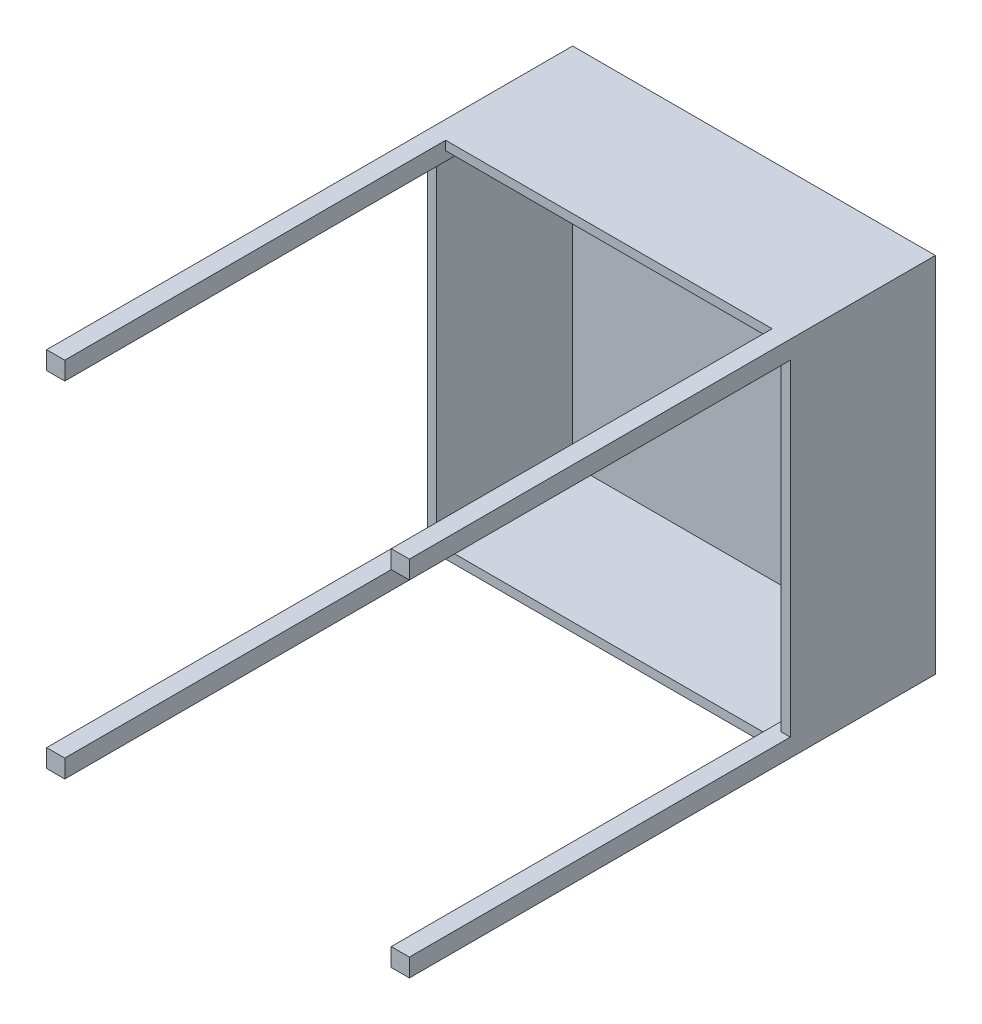
ISO-10303-21;
HEADER;
FILE_DESCRIPTION(('STEP AP214'),'2;1');
FILE_NAME('part.step','',(''),(''),'','','');
FILE_SCHEMA(('AUTOMOTIVE_DESIGN { 1 0 10303 214 1 1 1 1 }'));
ENDSEC;
DATA;
#1=APPLICATION_CONTEXT('core data for automotive mechanical design processes');
#2=APPLICATION_PROTOCOL_DEFINITION('international standard','automotive_design',2000,#1);
#3=PRODUCT_CONTEXT('',#1,'mechanical');
#4=PRODUCT('Part','Part','',(#3));
#5=PRODUCT_RELATED_PRODUCT_CATEGORY('part','',(#4));
#6=PRODUCT_DEFINITION_FORMATION('','',#4);
#7=PRODUCT_DEFINITION_CONTEXT('part definition',#1,'design');
#8=PRODUCT_DEFINITION('design','',#6,#7);
#9=PRODUCT_DEFINITION_SHAPE('','',#8);
#10=(LENGTH_UNIT() NAMED_UNIT(*) SI_UNIT(.MILLI.,.METRE.));
#11=(NAMED_UNIT(*) PLANE_ANGLE_UNIT() SI_UNIT($,.RADIAN.));
#12=(NAMED_UNIT(*) SI_UNIT($,.STERADIAN.) SOLID_ANGLE_UNIT());
#13=UNCERTAINTY_MEASURE_WITH_UNIT(LENGTH_MEASURE(1.E-05),#10,'distance_accuracy_value','');
#14=(GEOMETRIC_REPRESENTATION_CONTEXT(3) GLOBAL_UNCERTAINTY_ASSIGNED_CONTEXT((#13)) GLOBAL_UNIT_ASSIGNED_CONTEXT((#10,
#11,#12)) REPRESENTATION_CONTEXT('',''));
#15=CARTESIAN_POINT('',(0.,0.,0.));
#16=DIRECTION('',(0.,0.,1.));
#17=DIRECTION('',(1.,0.,0.));
#18=AXIS2_PLACEMENT_3D('',#15,#16,#17);
#19=CARTESIAN_POINT('',(0.,0.,0.));
#20=DIRECTION('',(0.,1.,0.));
#21=DIRECTION('',(1.,0.,0.));
#22=AXIS2_PLACEMENT_3D('',#19,#20,#21);
#23=PLANE('',#22);
#24=DIRECTION('',(0.,0.,1.));
#25=VECTOR('',#24,1.);
#26=CARTESIAN_POINT('',(1000.,0.,0.));
#27=LINE('',#26,#25);
#28=CARTESIAN_POINT('',(1000.,0.,0.));
#29=VERTEX_POINT('',#28);
#30=CARTESIAN_POINT('',(1000.,0.,1450.));
#31=VERTEX_POINT('',#30);
#32=EDGE_CURVE('E427',#29,#31,#27,.T.);
#33=ORIENTED_EDGE('',*,*,#32,.T.);
#34=DIRECTION('',(1.,0.,0.));
#35=VECTOR('',#34,1.);
#36=CARTESIAN_POINT('',(950.,0.,1450.));
#37=LINE('',#36,#35);
#38=CARTESIAN_POINT('',(950.,0.,1450.));
#39=VERTEX_POINT('',#38);
#40=EDGE_CURVE('E281',#39,#31,#37,.T.);
#41=ORIENTED_EDGE('',*,*,#40,.F.);
#42=DIRECTION('',(0.,0.,1.));
#43=VECTOR('',#42,1.);
#44=CARTESIAN_POINT('',(950.,0.,0.));
#45=LINE('',#44,#43);
#46=CARTESIAN_POINT('',(950.,0.,400.));
#47=VERTEX_POINT('',#46);
#48=EDGE_CURVE('E315',#47,#39,#45,.T.);
#49=ORIENTED_EDGE('',*,*,#48,.F.);
#50=DIRECTION('',(1.,0.,0.));
#51=VECTOR('',#50,1.);
#52=CARTESIAN_POINT('',(0.,0.,400.));
#53=LINE('',#52,#51);
#54=CARTESIAN_POINT('',(50.,0.,400.));
#55=VERTEX_POINT('',#54);
#56=EDGE_CURVE('E337',#55,#47,#53,.T.);
#57=ORIENTED_EDGE('',*,*,#56,.F.);
#58=DIRECTION('',(0.,0.,1.));
#59=VECTOR('',#58,1.);
#60=CARTESIAN_POINT('',(50.,0.,0.));
#61=LINE('',#60,#59);
#62=CARTESIAN_POINT('',(50.,0.,1450.));
#63=VERTEX_POINT('',#62);
#64=EDGE_CURVE('E235',#55,#63,#61,.T.);
#65=ORIENTED_EDGE('',*,*,#64,.T.);
#66=DIRECTION('',(1.,0.,0.));
#67=VECTOR('',#66,1.);
#68=CARTESIAN_POINT('',(0.,0.,1450.));
#69=LINE('',#68,#67);
#70=CARTESIAN_POINT('',(0.,0.,1450.));
#71=VERTEX_POINT('',#70);
#72=EDGE_CURVE('E229',#71,#63,#69,.T.);
#73=ORIENTED_EDGE('',*,*,#72,.F.);
#74=DIRECTION('',(0.,0.,1.));
#75=VECTOR('',#74,1.);
#76=CARTESIAN_POINT('',(0.,0.,0.));
#77=LINE('',#76,#75);
#78=CARTESIAN_POINT('',(0.,0.,0.));
#79=VERTEX_POINT('',#78);
#80=EDGE_CURVE('E232',#79,#71,#77,.T.);
#81=ORIENTED_EDGE('',*,*,#80,.F.);
#82=DIRECTION('',(1.,0.,0.));
#83=VECTOR('',#82,1.);
#84=CARTESIAN_POINT('',(0.,0.,0.));
#85=LINE('',#84,#83);
#86=EDGE_CURVE('E9',#79,#29,#85,.T.);
#87=ORIENTED_EDGE('',*,*,#86,.T.);
#88=EDGE_LOOP('',(#33,#41,#49,#57,#65,#73,#81,#87));
#89=FACE_BOUND('',#88,.T.);
#90=ADVANCED_FACE('F15',(#89),#23,.F.);
#91=CARTESIAN_POINT('',(0.,0.,0.));
#92=DIRECTION('',(0.,0.,1.));
#93=DIRECTION('',(1.,0.,0.));
#94=AXIS2_PLACEMENT_3D('',#91,#92,#93);
#95=PLANE('',#94);
#96=DIRECTION('',(0.,-1.,0.));
#97=VECTOR('',#96,1.);
#98=CARTESIAN_POINT('',(1000.,1000.,0.));
#99=LINE('',#98,#97);
#100=CARTESIAN_POINT('',(1000.,1000.,0.));
#101=VERTEX_POINT('',#100);
#102=EDGE_CURVE('E282',#101,#29,#99,.T.);
#103=ORIENTED_EDGE('',*,*,#102,.T.);
#104=ORIENTED_EDGE('',*,*,#86,.F.);
#105=DIRECTION('',(0.,-1.,0.));
#106=VECTOR('',#105,1.);
#107=CARTESIAN_POINT('',(0.,1000.,0.));
#108=LINE('',#107,#106);
#109=CARTESIAN_POINT('',(0.,1000.,0.));
#110=VERTEX_POINT('',#109);
#111=EDGE_CURVE('E250',#110,#79,#108,.T.);
#112=ORIENTED_EDGE('',*,*,#111,.F.);
#113=DIRECTION('',(1.,0.,0.));
#114=VECTOR('',#113,1.);
#115=CARTESIAN_POINT('',(0.,1000.,0.));
#116=LINE('',#115,#114);
#117=EDGE_CURVE('E23',#110,#101,#116,.T.);
#118=ORIENTED_EDGE('',*,*,#117,.T.);
#119=EDGE_LOOP('',(#103,#104,#112,#118));
#120=FACE_BOUND('',#119,.T.);
#121=ADVANCED_FACE('F544',(#120),#95,.F.);
#122=CARTESIAN_POINT('',(0.,1000.,0.));
#123=DIRECTION('',(0.,1.,0.));
#124=DIRECTION('',(1.,0.,0.));
#125=AXIS2_PLACEMENT_3D('',#122,#123,#124);
#126=PLANE('',#125);
#127=ORIENTED_EDGE('',*,*,#117,.F.);
#128=DIRECTION('',(0.,0.,-1.));
#129=VECTOR('',#128,1.);
#130=CARTESIAN_POINT('',(0.,1000.,1450.));
#131=LINE('',#130,#129);
#132=CARTESIAN_POINT('',(0.,1000.,1450.));
#133=VERTEX_POINT('',#132);
#134=EDGE_CURVE('E305',#133,#110,#131,.T.);
#135=ORIENTED_EDGE('',*,*,#134,.F.);
#136=DIRECTION('',(1.,0.,0.));
#137=VECTOR('',#136,1.);
#138=CARTESIAN_POINT('',(0.,1000.,1450.));
#139=LINE('',#138,#137);
#140=CARTESIAN_POINT('',(50.,1000.,1450.));
#141=VERTEX_POINT('',#140);
#142=EDGE_CURVE('E311',#133,#141,#139,.T.);
#143=ORIENTED_EDGE('',*,*,#142,.T.);
#144=DIRECTION('',(0.,0.,1.));
#145=VECTOR('',#144,1.);
#146=CARTESIAN_POINT('',(50.,1000.,0.));
#147=LINE('',#146,#145);
#148=CARTESIAN_POINT('',(50.,1000.,400.));
#149=VERTEX_POINT('',#148);
#150=EDGE_CURVE('E466',#149,#141,#147,.T.);
#151=ORIENTED_EDGE('',*,*,#150,.F.);
#152=DIRECTION('',(1.,0.,0.));
#153=VECTOR('',#152,1.);
#154=CARTESIAN_POINT('',(0.,1000.,400.));
#155=LINE('',#154,#153);
#156=CARTESIAN_POINT('',(950.,1000.,400.));
#157=VERTEX_POINT('',#156);
#158=EDGE_CURVE('E471',#149,#157,#155,.T.);
#159=ORIENTED_EDGE('',*,*,#158,.T.);
#160=DIRECTION('',(0.,0.,1.));
#161=VECTOR('',#160,1.);
#162=CARTESIAN_POINT('',(950.,1000.,0.));
#163=LINE('',#162,#161);
#164=CARTESIAN_POINT('',(950.,1000.,1450.));
#165=VERTEX_POINT('',#164);
#166=EDGE_CURVE('E441',#157,#165,#163,.T.);
#167=ORIENTED_EDGE('',*,*,#166,.T.);
#168=DIRECTION('',(1.,0.,0.));
#169=VECTOR('',#168,1.);
#170=CARTESIAN_POINT('',(950.,1000.,1450.));
#171=LINE('',#170,#169);
#172=CARTESIAN_POINT('',(1000.,1000.,1450.));
#173=VERTEX_POINT('',#172);
#174=EDGE_CURVE('E384',#165,#173,#171,.T.);
#175=ORIENTED_EDGE('',*,*,#174,.T.);
#176=DIRECTION('',(0.,0.,-1.));
#177=VECTOR('',#176,1.);
#178=CARTESIAN_POINT('',(1000.,1000.,1450.));
#179=LINE('',#178,#177);
#180=EDGE_CURVE('E277',#173,#101,#179,.T.);
#181=ORIENTED_EDGE('',*,*,#180,.T.);
#182=EDGE_LOOP('',(#127,#135,#143,#151,#159,#167,#175,#181));
#183=FACE_BOUND('',#182,.T.);
#184=ADVANCED_FACE('F502',(#183),#126,.T.);
#185=CARTESIAN_POINT('',(0.,950.,1450.));
#186=DIRECTION('',(0.,0.,1.));
#187=DIRECTION('',(1.,0.,0.));
#188=AXIS2_PLACEMENT_3D('',#185,#186,#187);
#189=PLANE('',#188);
#190=DIRECTION('',(0.,1.,0.));
#191=VECTOR('',#190,1.);
#192=CARTESIAN_POINT('',(0.,950.,1450.));
#193=LINE('',#192,#191);
#194=CARTESIAN_POINT('',(0.,950.,1450.));
#195=VERTEX_POINT('',#194);
#196=EDGE_CURVE('E301',#195,#133,#193,.T.);
#197=ORIENTED_EDGE('',*,*,#196,.F.);
#198=DIRECTION('',(1.,0.,0.));
#199=VECTOR('',#198,1.);
#200=CARTESIAN_POINT('',(0.,950.,1450.));
#201=LINE('',#200,#199);
#202=CARTESIAN_POINT('',(50.,950.,1450.));
#203=VERTEX_POINT('',#202);
#204=EDGE_CURVE('E373',#195,#203,#201,.T.);
#205=ORIENTED_EDGE('',*,*,#204,.T.);
#206=DIRECTION('',(0.,1.,0.));
#207=VECTOR('',#206,1.);
#208=CARTESIAN_POINT('',(50.,950.,1450.));
#209=LINE('',#208,#207);
#210=EDGE_CURVE('E467',#203,#141,#209,.T.);
#211=ORIENTED_EDGE('',*,*,#210,.T.);
#212=ORIENTED_EDGE('',*,*,#142,.F.);
#213=EDGE_LOOP('',(#197,#205,#211,#212));
#214=FACE_BOUND('',#213,.T.);
#215=ADVANCED_FACE('F506',(#214),#189,.T.);
#216=CARTESIAN_POINT('',(0.,950.,0.));
#217=DIRECTION('',(0.,1.,0.));
#218=DIRECTION('',(1.,0.,0.));
#219=AXIS2_PLACEMENT_3D('',#216,#217,#218);
#220=PLANE('',#219);
#221=ORIENTED_EDGE('',*,*,#204,.F.);
#222=DIRECTION('',(0.,0.,1.));
#223=VECTOR('',#222,1.);
#224=CARTESIAN_POINT('',(0.,950.,0.));
#225=LINE('',#224,#223);
#226=CARTESIAN_POINT('',(0.,950.,400.));
#227=VERTEX_POINT('',#226);
#228=EDGE_CURVE('E268',#227,#195,#225,.T.);
#229=ORIENTED_EDGE('',*,*,#228,.F.);
#230=DIRECTION('',(-1.,0.,0.));
#231=VECTOR('',#230,1.);
#232=CARTESIAN_POINT('',(0.,950.,400.));
#233=LINE('',#232,#231);
#234=CARTESIAN_POINT('',(25.,950.,400.));
#235=VERTEX_POINT('',#234);
#236=EDGE_CURVE('E35',#235,#227,#233,.T.);
#237=ORIENTED_EDGE('',*,*,#236,.F.);
#238=DIRECTION('',(0.,0.,1.));
#239=VECTOR('',#238,1.);
#240=CARTESIAN_POINT('',(25.,950.,12.5));
#241=LINE('',#240,#239);
#242=CARTESIAN_POINT('',(25.,950.,25.));
#243=VERTEX_POINT('',#242);
#244=EDGE_CURVE('E382',#243,#235,#241,.T.);
#245=ORIENTED_EDGE('',*,*,#244,.F.);
#246=DIRECTION('',(-1.,0.,0.));
#247=VECTOR('',#246,1.);
#248=CARTESIAN_POINT('',(12.5,950.,25.));
#249=LINE('',#248,#247);
#250=CARTESIAN_POINT('',(50.,950.,25.));
#251=VERTEX_POINT('',#250);
#252=EDGE_CURVE('E383',#251,#243,#249,.T.);
#253=ORIENTED_EDGE('',*,*,#252,.F.);
#254=DIRECTION('',(0.,0.,1.));
#255=VECTOR('',#254,1.);
#256=CARTESIAN_POINT('',(50.,950.,0.));
#257=LINE('',#256,#255);
#258=EDGE_CURVE('E428',#251,#203,#257,.T.);
#259=ORIENTED_EDGE('',*,*,#258,.T.);
#260=EDGE_LOOP('',(#221,#229,#237,#245,#253,#259));
#261=FACE_BOUND('',#260,.T.);
#262=ADVANCED_FACE('F561',(#261),#220,.F.);
#263=CARTESIAN_POINT('',(0.,0.,400.));
#264=DIRECTION('',(0.,0.,1.));
#265=DIRECTION('',(1.,0.,0.));
#266=AXIS2_PLACEMENT_3D('',#263,#264,#265);
#267=PLANE('',#266);
#268=DIRECTION('',(0.,1.,0.));
#269=VECTOR('',#268,1.);
#270=CARTESIAN_POINT('',(0.,0.,400.));
#271=LINE('',#270,#269);
#272=CARTESIAN_POINT('',(0.,50.,400.));
#273=VERTEX_POINT('',#272);
#274=EDGE_CURVE('E264',#273,#227,#271,.T.);
#275=ORIENTED_EDGE('',*,*,#274,.F.);
#276=DIRECTION('',(-1.,0.,0.));
#277=VECTOR('',#276,1.);
#278=CARTESIAN_POINT('',(0.,50.,400.));
#279=LINE('',#278,#277);
#280=CARTESIAN_POINT('',(25.,50.,400.));
#281=VERTEX_POINT('',#280);
#282=EDGE_CURVE('E44',#281,#273,#279,.T.);
#283=ORIENTED_EDGE('',*,*,#282,.F.);
#284=DIRECTION('',(0.,1.,0.));
#285=VECTOR('',#284,1.);
#286=CARTESIAN_POINT('',(25.,12.5,400.));
#287=LINE('',#286,#285);
#288=EDGE_CURVE('E356',#281,#235,#287,.T.);
#289=ORIENTED_EDGE('',*,*,#288,.T.);
#290=ORIENTED_EDGE('',*,*,#236,.T.);
#291=EDGE_LOOP('',(#275,#283,#289,#290));
#292=FACE_BOUND('',#291,.T.);
#293=ADVANCED_FACE('F557',(#292),#267,.T.);
#294=CARTESIAN_POINT('',(0.,50.,0.));
#295=DIRECTION('',(0.,1.,0.));
#296=DIRECTION('',(1.,0.,0.));
#297=AXIS2_PLACEMENT_3D('',#294,#295,#296);
#298=PLANE('',#297);
#299=DIRECTION('',(0.,0.,1.));
#300=VECTOR('',#299,1.);
#301=CARTESIAN_POINT('',(50.,50.,0.));
#302=LINE('',#301,#300);
#303=CARTESIAN_POINT('',(50.,50.,25.));
#304=VERTEX_POINT('',#303);
#305=CARTESIAN_POINT('',(50.,50.,1450.));
#306=VERTEX_POINT('',#305);
#307=EDGE_CURVE('E274',#304,#306,#302,.T.);
#308=ORIENTED_EDGE('',*,*,#307,.F.);
#309=DIRECTION('',(-1.,0.,0.));
#310=VECTOR('',#309,1.);
#311=CARTESIAN_POINT('',(12.5,50.,25.));
#312=LINE('',#311,#310);
#313=CARTESIAN_POINT('',(25.,50.,25.));
#314=VERTEX_POINT('',#313);
#315=EDGE_CURVE('E454',#304,#314,#312,.T.);
#316=ORIENTED_EDGE('',*,*,#315,.T.);
#317=DIRECTION('',(0.,0.,1.));
#318=VECTOR('',#317,1.);
#319=CARTESIAN_POINT('',(25.,50.,12.5));
#320=LINE('',#319,#318);
#321=EDGE_CURVE('E378',#314,#281,#320,.T.);
#322=ORIENTED_EDGE('',*,*,#321,.T.);
#323=ORIENTED_EDGE('',*,*,#282,.T.);
#324=DIRECTION('',(0.,0.,1.));
#325=VECTOR('',#324,1.);
#326=CARTESIAN_POINT('',(0.,50.,0.));
#327=LINE('',#326,#325);
#328=CARTESIAN_POINT('',(0.,50.,1450.));
#329=VERTEX_POINT('',#328);
#330=EDGE_CURVE('E258',#273,#329,#327,.T.);
#331=ORIENTED_EDGE('',*,*,#330,.T.);
#332=DIRECTION('',(1.,0.,0.));
#333=VECTOR('',#332,1.);
#334=CARTESIAN_POINT('',(0.,50.,1450.));
#335=LINE('',#334,#333);
#336=EDGE_CURVE('E255',#329,#306,#335,.T.);
#337=ORIENTED_EDGE('',*,*,#336,.T.);
#338=EDGE_LOOP('',(#308,#316,#322,#323,#331,#337));
#339=FACE_BOUND('',#338,.T.);
#340=ADVANCED_FACE('F556',(#339),#298,.T.);
#341=CARTESIAN_POINT('',(25.,25.,25.));
#342=DIRECTION('',(1.,0.,0.));
#343=DIRECTION('',(0.,1.,0.));
#344=AXIS2_PLACEMENT_3D('',#341,#342,#343);
#345=PLANE('',#344);
#346=ORIENTED_EDGE('',*,*,#321,.F.);
#347=DIRECTION('',(0.,1.,0.));
#348=VECTOR('',#347,1.);
#349=CARTESIAN_POINT('',(25.,25.,25.));
#350=LINE('',#349,#348);
#351=EDGE_CURVE('E417',#314,#243,#350,.T.);
#352=ORIENTED_EDGE('',*,*,#351,.T.);
#353=ORIENTED_EDGE('',*,*,#244,.T.);
#354=ORIENTED_EDGE('',*,*,#288,.F.);
#355=EDGE_LOOP('',(#346,#352,#353,#354));
#356=FACE_BOUND('',#355,.T.);
#357=ADVANCED_FACE('F559',(#356),#345,.T.);
#358=CARTESIAN_POINT('',(25.,25.,25.));
#359=DIRECTION('',(0.,0.,1.));
#360=DIRECTION('',(1.,0.,0.));
#361=AXIS2_PLACEMENT_3D('',#358,#359,#360);
#362=PLANE('',#361);
#363=ORIENTED_EDGE('',*,*,#351,.F.);
#364=ORIENTED_EDGE('',*,*,#315,.F.);
#365=DIRECTION('',(0.,1.,0.));
#366=VECTOR('',#365,1.);
#367=CARTESIAN_POINT('',(50.,12.5,25.));
#368=LINE('',#367,#366);
#369=CARTESIAN_POINT('',(50.,25.,25.));
#370=VERTEX_POINT('',#369);
#371=EDGE_CURVE('E271',#370,#304,#368,.T.);
#372=ORIENTED_EDGE('',*,*,#371,.F.);
#373=DIRECTION('',(1.,0.,0.));
#374=VECTOR('',#373,1.);
#375=CARTESIAN_POINT('',(25.,25.,25.));
#376=LINE('',#375,#374);
#377=CARTESIAN_POINT('',(950.,25.,25.));
#378=VERTEX_POINT('',#377);
#379=EDGE_CURVE('E411',#370,#378,#376,.T.);
#380=ORIENTED_EDGE('',*,*,#379,.T.);
#381=DIRECTION('',(0.,1.,0.));
#382=VECTOR('',#381,1.);
#383=CARTESIAN_POINT('',(950.,12.5,25.));
#384=LINE('',#383,#382);
#385=CARTESIAN_POINT('',(950.,50.,25.));
#386=VERTEX_POINT('',#385);
#387=EDGE_CURVE('E316',#378,#386,#384,.T.);
#388=ORIENTED_EDGE('',*,*,#387,.T.);
#389=DIRECTION('',(-1.,0.,0.));
#390=VECTOR('',#389,1.);
#391=CARTESIAN_POINT('',(487.5,50.,25.));
#392=LINE('',#391,#390);
#393=CARTESIAN_POINT('',(975.,50.,25.));
#394=VERTEX_POINT('',#393);
#395=EDGE_CURVE('E366',#394,#386,#392,.T.);
#396=ORIENTED_EDGE('',*,*,#395,.F.);
#397=DIRECTION('',(0.,1.,0.));
#398=VECTOR('',#397,1.);
#399=CARTESIAN_POINT('',(975.,25.,25.));
#400=LINE('',#399,#398);
#401=CARTESIAN_POINT('',(975.,950.,25.));
#402=VERTEX_POINT('',#401);
#403=EDGE_CURVE('E388',#394,#402,#400,.T.);
#404=ORIENTED_EDGE('',*,*,#403,.T.);
#405=DIRECTION('',(-1.,0.,0.));
#406=VECTOR('',#405,1.);
#407=CARTESIAN_POINT('',(487.5,950.,25.));
#408=LINE('',#407,#406);
#409=CARTESIAN_POINT('',(950.,950.,25.));
#410=VERTEX_POINT('',#409);
#411=EDGE_CURVE('E289',#402,#410,#408,.T.);
#412=ORIENTED_EDGE('',*,*,#411,.T.);
#413=DIRECTION('',(0.,1.,0.));
#414=VECTOR('',#413,1.);
#415=CARTESIAN_POINT('',(950.,487.5,25.));
#416=LINE('',#415,#414);
#417=CARTESIAN_POINT('',(950.,975.,25.));
#418=VERTEX_POINT('',#417);
#419=EDGE_CURVE('E288',#410,#418,#416,.T.);
#420=ORIENTED_EDGE('',*,*,#419,.T.);
#421=DIRECTION('',(1.,0.,0.));
#422=VECTOR('',#421,1.);
#423=CARTESIAN_POINT('',(25.,975.,25.));
#424=LINE('',#423,#422);
#425=CARTESIAN_POINT('',(50.,975.,25.));
#426=VERTEX_POINT('',#425);
#427=EDGE_CURVE('E433',#426,#418,#424,.T.);
#428=ORIENTED_EDGE('',*,*,#427,.F.);
#429=DIRECTION('',(0.,1.,0.));
#430=VECTOR('',#429,1.);
#431=CARTESIAN_POINT('',(50.,487.5,25.));
#432=LINE('',#431,#430);
#433=EDGE_CURVE('E432',#251,#426,#432,.T.);
#434=ORIENTED_EDGE('',*,*,#433,.F.);
#435=ORIENTED_EDGE('',*,*,#252,.T.);
#436=EDGE_LOOP('',(#363,#364,#372,#380,#388,#396,#404,#412,#420,#428,#434,#435));
#437=FACE_BOUND('',#436,.T.);
#438=ADVANCED_FACE('F564',(#437),#362,.T.);
#439=CARTESIAN_POINT('',(25.,25.,25.));
#440=DIRECTION('',(0.,1.,0.));
#441=DIRECTION('',(1.,0.,0.));
#442=AXIS2_PLACEMENT_3D('',#439,#440,#441);
#443=PLANE('',#442);
#444=DIRECTION('',(0.,0.,-1.));
#445=VECTOR('',#444,1.);
#446=CARTESIAN_POINT('',(950.,25.,12.5));
#447=LINE('',#446,#445);
#448=CARTESIAN_POINT('',(950.,25.,400.));
#449=VERTEX_POINT('',#448);
#450=EDGE_CURVE('E312',#449,#378,#447,.T.);
#451=ORIENTED_EDGE('',*,*,#450,.T.);
#452=ORIENTED_EDGE('',*,*,#379,.F.);
#453=DIRECTION('',(0.,0.,-1.));
#454=VECTOR('',#453,1.);
#455=CARTESIAN_POINT('',(50.,25.,12.5));
#456=LINE('',#455,#454);
#457=CARTESIAN_POINT('',(50.,25.,400.));
#458=VERTEX_POINT('',#457);
#459=EDGE_CURVE('E275',#458,#370,#456,.T.);
#460=ORIENTED_EDGE('',*,*,#459,.F.);
#461=DIRECTION('',(-1.,0.,0.));
#462=VECTOR('',#461,1.);
#463=CARTESIAN_POINT('',(12.5,25.,400.));
#464=LINE('',#463,#462);
#465=EDGE_CURVE('E345',#449,#458,#464,.T.);
#466=ORIENTED_EDGE('',*,*,#465,.F.);
#467=EDGE_LOOP('',(#451,#452,#460,#466));
#468=FACE_BOUND('',#467,.T.);
#469=ADVANCED_FACE('F581',(#468),#443,.T.);
#470=CARTESIAN_POINT('',(950.,0.,1450.));
#471=DIRECTION('',(0.,0.,1.));
#472=DIRECTION('',(1.,0.,0.));
#473=AXIS2_PLACEMENT_3D('',#470,#471,#472);
#474=PLANE('',#473);
#475=DIRECTION('',(0.,1.,0.));
#476=VECTOR('',#475,1.);
#477=CARTESIAN_POINT('',(950.,0.,1450.));
#478=LINE('',#477,#476);
#479=CARTESIAN_POINT('',(950.,50.,1450.));
#480=VERTEX_POINT('',#479);
#481=EDGE_CURVE('E334',#39,#480,#478,.T.);
#482=ORIENTED_EDGE('',*,*,#481,.F.);
#483=ORIENTED_EDGE('',*,*,#40,.T.);
#484=DIRECTION('',(0.,1.,0.));
#485=VECTOR('',#484,1.);
#486=CARTESIAN_POINT('',(1000.,0.,1450.));
#487=LINE('',#486,#485);
#488=CARTESIAN_POINT('',(1000.,50.,1450.));
#489=VERTEX_POINT('',#488);
#490=EDGE_CURVE('E424',#31,#489,#487,.T.);
#491=ORIENTED_EDGE('',*,*,#490,.T.);
#492=DIRECTION('',(1.,0.,0.));
#493=VECTOR('',#492,1.);
#494=CARTESIAN_POINT('',(950.,50.,1450.));
#495=LINE('',#494,#493);
#496=EDGE_CURVE('E361',#480,#489,#495,.T.);
#497=ORIENTED_EDGE('',*,*,#496,.F.);
#498=EDGE_LOOP('',(#482,#483,#491,#497));
#499=FACE_BOUND('',#498,.T.);
#500=ADVANCED_FACE('F542',(#499),#474,.T.);
#501=CARTESIAN_POINT('',(1000.,0.,0.));
#502=DIRECTION('',(1.,0.,0.));
#503=DIRECTION('',(0.,1.,0.));
#504=AXIS2_PLACEMENT_3D('',#501,#502,#503);
#505=PLANE('',#504);
#506=DIRECTION('',(0.,1.,0.));
#507=VECTOR('',#506,1.);
#508=CARTESIAN_POINT('',(1000.,0.,400.));
#509=LINE('',#508,#507);
#510=CARTESIAN_POINT('',(1000.,50.,400.));
#511=VERTEX_POINT('',#510);
#512=CARTESIAN_POINT('',(1000.,950.,400.));
#513=VERTEX_POINT('',#512);
#514=EDGE_CURVE('E365',#511,#513,#509,.T.);
#515=ORIENTED_EDGE('',*,*,#514,.F.);
#516=DIRECTION('',(0.,0.,1.));
#517=VECTOR('',#516,1.);
#518=CARTESIAN_POINT('',(1000.,50.,0.));
#519=LINE('',#518,#517);
#520=EDGE_CURVE('E360',#511,#489,#519,.T.);
#521=ORIENTED_EDGE('',*,*,#520,.T.);
#522=ORIENTED_EDGE('',*,*,#490,.F.);
#523=ORIENTED_EDGE('',*,*,#32,.F.);
#524=ORIENTED_EDGE('',*,*,#102,.F.);
#525=ORIENTED_EDGE('',*,*,#180,.F.);
#526=DIRECTION('',(0.,1.,0.));
#527=VECTOR('',#526,1.);
#528=CARTESIAN_POINT('',(1000.,950.,1450.));
#529=LINE('',#528,#527);
#530=CARTESIAN_POINT('',(1000.,950.,1450.));
#531=VERTEX_POINT('',#530);
#532=EDGE_CURVE('E389',#531,#173,#529,.T.);
#533=ORIENTED_EDGE('',*,*,#532,.F.);
#534=DIRECTION('',(0.,0.,1.));
#535=VECTOR('',#534,1.);
#536=CARTESIAN_POINT('',(1000.,950.,0.));
#537=LINE('',#536,#535);
#538=EDGE_CURVE('E423',#513,#531,#537,.T.);
#539=ORIENTED_EDGE('',*,*,#538,.F.);
#540=EDGE_LOOP('',(#515,#521,#522,#523,#524,#525,#533,#539));
#541=FACE_BOUND('',#540,.T.);
#542=ADVANCED_FACE('F523',(#541),#505,.T.);
#543=CARTESIAN_POINT('',(975.,25.,25.));
#544=DIRECTION('',(1.,0.,0.));
#545=DIRECTION('',(0.,1.,0.));
#546=AXIS2_PLACEMENT_3D('',#543,#544,#545);
#547=PLANE('',#546);
#548=DIRECTION('',(0.,1.,0.));
#549=VECTOR('',#548,1.);
#550=CARTESIAN_POINT('',(975.,12.5,400.));
#551=LINE('',#550,#549);
#552=CARTESIAN_POINT('',(975.,50.,400.));
#553=VERTEX_POINT('',#552);
#554=CARTESIAN_POINT('',(975.,950.,400.));
#555=VERTEX_POINT('',#554);
#556=EDGE_CURVE('E393',#553,#555,#551,.T.);
#557=ORIENTED_EDGE('',*,*,#556,.T.);
#558=DIRECTION('',(0.,0.,1.));
#559=VECTOR('',#558,1.);
#560=CARTESIAN_POINT('',(975.,950.,12.5));
#561=LINE('',#560,#559);
#562=EDGE_CURVE('E293',#402,#555,#561,.T.);
#563=ORIENTED_EDGE('',*,*,#562,.F.);
#564=ORIENTED_EDGE('',*,*,#403,.F.);
#565=DIRECTION('',(0.,0.,1.));
#566=VECTOR('',#565,1.);
#567=CARTESIAN_POINT('',(975.,50.,12.5));
#568=LINE('',#567,#566);
#569=EDGE_CURVE('E377',#394,#553,#568,.T.);
#570=ORIENTED_EDGE('',*,*,#569,.T.);
#571=EDGE_LOOP('',(#557,#563,#564,#570));
#572=FACE_BOUND('',#571,.T.);
#573=ADVANCED_FACE('F570',(#572),#547,.F.);
#574=CARTESIAN_POINT('',(950.,950.,1450.));
#575=DIRECTION('',(0.,0.,1.));
#576=DIRECTION('',(1.,0.,0.));
#577=AXIS2_PLACEMENT_3D('',#574,#575,#576);
#578=PLANE('',#577);
#579=DIRECTION('',(0.,1.,0.));
#580=VECTOR('',#579,1.);
#581=CARTESIAN_POINT('',(950.,950.,1450.));
#582=LINE('',#581,#580);
#583=CARTESIAN_POINT('',(950.,950.,1450.));
#584=VERTEX_POINT('',#583);
#585=EDGE_CURVE('E437',#584,#165,#582,.T.);
#586=ORIENTED_EDGE('',*,*,#585,.F.);
#587=DIRECTION('',(1.,0.,0.));
#588=VECTOR('',#587,1.);
#589=CARTESIAN_POINT('',(950.,950.,1450.));
#590=LINE('',#589,#588);
#591=EDGE_CURVE('E397',#584,#531,#590,.T.);
#592=ORIENTED_EDGE('',*,*,#591,.T.);
#593=ORIENTED_EDGE('',*,*,#532,.T.);
#594=ORIENTED_EDGE('',*,*,#174,.F.);
#595=EDGE_LOOP('',(#586,#592,#593,#594));
#596=FACE_BOUND('',#595,.T.);
#597=ADVANCED_FACE('F521',(#596),#578,.T.);
#598=CARTESIAN_POINT('',(0.,0.,400.));
#599=DIRECTION('',(0.,0.,1.));
#600=DIRECTION('',(1.,0.,0.));
#601=AXIS2_PLACEMENT_3D('',#598,#599,#600);
#602=PLANE('',#601);
#603=ORIENTED_EDGE('',*,*,#158,.F.);
#604=DIRECTION('',(0.,1.,0.));
#605=VECTOR('',#604,1.);
#606=CARTESIAN_POINT('',(50.,475.,400.));
#607=LINE('',#606,#605);
#608=CARTESIAN_POINT('',(50.,975.,400.));
#609=VERTEX_POINT('',#608);
#610=EDGE_CURVE('E462',#609,#149,#607,.T.);
#611=ORIENTED_EDGE('',*,*,#610,.F.);
#612=DIRECTION('',(-1.,0.,0.));
#613=VECTOR('',#612,1.);
#614=CARTESIAN_POINT('',(12.5,975.,400.));
#615=LINE('',#614,#613);
#616=CARTESIAN_POINT('',(950.,975.,400.));
#617=VERTEX_POINT('',#616);
#618=EDGE_CURVE('E283',#617,#609,#615,.T.);
#619=ORIENTED_EDGE('',*,*,#618,.F.);
#620=DIRECTION('',(0.,1.,0.));
#621=VECTOR('',#620,1.);
#622=CARTESIAN_POINT('',(950.,475.,400.));
#623=LINE('',#622,#621);
#624=EDGE_CURVE('E322',#617,#157,#623,.T.);
#625=ORIENTED_EDGE('',*,*,#624,.T.);
#626=EDGE_LOOP('',(#603,#611,#619,#625));
#627=FACE_BOUND('',#626,.T.);
#628=ADVANCED_FACE('F512',(#627),#602,.T.);
#629=CARTESIAN_POINT('',(50.,950.,0.));
#630=DIRECTION('',(1.,0.,0.));
#631=DIRECTION('',(0.,1.,0.));
#632=AXIS2_PLACEMENT_3D('',#629,#630,#631);
#633=PLANE('',#632);
#634=ORIENTED_EDGE('',*,*,#258,.F.);
#635=ORIENTED_EDGE('',*,*,#433,.T.);
#636=DIRECTION('',(0.,0.,-1.));
#637=VECTOR('',#636,1.);
#638=CARTESIAN_POINT('',(50.,975.,12.5));
#639=LINE('',#638,#637);
#640=EDGE_CURVE('E287',#609,#426,#639,.T.);
#641=ORIENTED_EDGE('',*,*,#640,.F.);
#642=ORIENTED_EDGE('',*,*,#610,.T.);
#643=ORIENTED_EDGE('',*,*,#150,.T.);
#644=ORIENTED_EDGE('',*,*,#210,.F.);
#645=EDGE_LOOP('',(#634,#635,#641,#642,#643,#644));
#646=FACE_BOUND('',#645,.T.);
#647=ADVANCED_FACE('F509',(#646),#633,.T.);
#648=CARTESIAN_POINT('',(25.,975.,25.));
#649=DIRECTION('',(0.,1.,0.));
#650=DIRECTION('',(1.,0.,0.));
#651=AXIS2_PLACEMENT_3D('',#648,#649,#650);
#652=PLANE('',#651);
#653=ORIENTED_EDGE('',*,*,#618,.T.);
#654=ORIENTED_EDGE('',*,*,#640,.T.);
#655=ORIENTED_EDGE('',*,*,#427,.T.);
#656=DIRECTION('',(0.,0.,-1.));
#657=VECTOR('',#656,1.);
#658=CARTESIAN_POINT('',(950.,975.,12.5));
#659=LINE('',#658,#657);
#660=EDGE_CURVE('E318',#617,#418,#659,.T.);
#661=ORIENTED_EDGE('',*,*,#660,.F.);
#662=EDGE_LOOP('',(#653,#654,#655,#661));
#663=FACE_BOUND('',#662,.T.);
#664=ADVANCED_FACE('F567',(#663),#652,.F.);
#665=CARTESIAN_POINT('',(950.,950.,0.));
#666=DIRECTION('',(1.,0.,0.));
#667=DIRECTION('',(0.,1.,0.));
#668=AXIS2_PLACEMENT_3D('',#665,#666,#667);
#669=PLANE('',#668);
#670=ORIENTED_EDGE('',*,*,#585,.T.);
#671=ORIENTED_EDGE('',*,*,#166,.F.);
#672=ORIENTED_EDGE('',*,*,#624,.F.);
#673=ORIENTED_EDGE('',*,*,#660,.T.);
#674=ORIENTED_EDGE('',*,*,#419,.F.);
#675=DIRECTION('',(0.,0.,1.));
#676=VECTOR('',#675,1.);
#677=CARTESIAN_POINT('',(950.,950.,0.));
#678=LINE('',#677,#676);
#679=EDGE_CURVE('E294',#410,#584,#678,.T.);
#680=ORIENTED_EDGE('',*,*,#679,.T.);
#681=EDGE_LOOP('',(#670,#671,#672,#673,#674,#680));
#682=FACE_BOUND('',#681,.T.);
#683=ADVANCED_FACE('F517',(#682),#669,.F.);
#684=CARTESIAN_POINT('',(950.,950.,0.));
#685=DIRECTION('',(0.,1.,0.));
#686=DIRECTION('',(1.,0.,0.));
#687=AXIS2_PLACEMENT_3D('',#684,#685,#686);
#688=PLANE('',#687);
#689=ORIENTED_EDGE('',*,*,#591,.F.);
#690=ORIENTED_EDGE('',*,*,#679,.F.);
#691=ORIENTED_EDGE('',*,*,#411,.F.);
#692=ORIENTED_EDGE('',*,*,#562,.T.);
#693=DIRECTION('',(-1.,0.,0.));
#694=VECTOR('',#693,1.);
#695=CARTESIAN_POINT('',(475.,950.,400.));
#696=LINE('',#695,#694);
#697=EDGE_CURVE('E398',#513,#555,#696,.T.);
#698=ORIENTED_EDGE('',*,*,#697,.F.);
#699=ORIENTED_EDGE('',*,*,#538,.T.);
#700=EDGE_LOOP('',(#689,#690,#691,#692,#698,#699));
#701=FACE_BOUND('',#700,.T.);
#702=ADVANCED_FACE('F527',(#701),#688,.F.);
#703=CARTESIAN_POINT('',(0.,0.,400.));
#704=DIRECTION('',(0.,0.,1.));
#705=DIRECTION('',(1.,0.,0.));
#706=AXIS2_PLACEMENT_3D('',#703,#704,#705);
#707=PLANE('',#706);
#708=ORIENTED_EDGE('',*,*,#514,.T.);
#709=ORIENTED_EDGE('',*,*,#697,.T.);
#710=ORIENTED_EDGE('',*,*,#556,.F.);
#711=DIRECTION('',(-1.,0.,0.));
#712=VECTOR('',#711,1.);
#713=CARTESIAN_POINT('',(475.,50.,400.));
#714=LINE('',#713,#712);
#715=EDGE_CURVE('E370',#511,#553,#714,.T.);
#716=ORIENTED_EDGE('',*,*,#715,.F.);
#717=EDGE_LOOP('',(#708,#709,#710,#716));
#718=FACE_BOUND('',#717,.T.);
#719=ADVANCED_FACE('F532',(#718),#707,.T.);
#720=CARTESIAN_POINT('',(950.,50.,0.));
#721=DIRECTION('',(0.,1.,0.));
#722=DIRECTION('',(1.,0.,0.));
#723=AXIS2_PLACEMENT_3D('',#720,#721,#722);
#724=PLANE('',#723);
#725=ORIENTED_EDGE('',*,*,#520,.F.);
#726=ORIENTED_EDGE('',*,*,#715,.T.);
#727=ORIENTED_EDGE('',*,*,#569,.F.);
#728=ORIENTED_EDGE('',*,*,#395,.T.);
#729=DIRECTION('',(0.,0.,1.));
#730=VECTOR('',#729,1.);
#731=CARTESIAN_POINT('',(950.,50.,0.));
#732=LINE('',#731,#730);
#733=EDGE_CURVE('E330',#386,#480,#732,.T.);
#734=ORIENTED_EDGE('',*,*,#733,.T.);
#735=ORIENTED_EDGE('',*,*,#496,.T.);
#736=EDGE_LOOP('',(#725,#726,#727,#728,#734,#735));
#737=FACE_BOUND('',#736,.T.);
#738=ADVANCED_FACE('F537',(#737),#724,.T.);
#739=CARTESIAN_POINT('',(950.,0.,0.));
#740=DIRECTION('',(1.,0.,0.));
#741=DIRECTION('',(0.,1.,0.));
#742=AXIS2_PLACEMENT_3D('',#739,#740,#741);
#743=PLANE('',#742);
#744=ORIENTED_EDGE('',*,*,#481,.T.);
#745=ORIENTED_EDGE('',*,*,#733,.F.);
#746=ORIENTED_EDGE('',*,*,#387,.F.);
#747=ORIENTED_EDGE('',*,*,#450,.F.);
#748=DIRECTION('',(0.,1.,0.));
#749=VECTOR('',#748,1.);
#750=CARTESIAN_POINT('',(950.,0.,400.));
#751=LINE('',#750,#749);
#752=EDGE_CURVE('E341',#47,#449,#751,.T.);
#753=ORIENTED_EDGE('',*,*,#752,.F.);
#754=ORIENTED_EDGE('',*,*,#48,.T.);
#755=EDGE_LOOP('',(#744,#745,#746,#747,#753,#754));
#756=FACE_BOUND('',#755,.T.);
#757=ADVANCED_FACE('F573',(#756),#743,.F.);
#758=CARTESIAN_POINT('',(0.,0.,400.));
#759=DIRECTION('',(0.,0.,1.));
#760=DIRECTION('',(1.,0.,0.));
#761=AXIS2_PLACEMENT_3D('',#758,#759,#760);
#762=PLANE('',#761);
#763=ORIENTED_EDGE('',*,*,#56,.T.);
#764=ORIENTED_EDGE('',*,*,#752,.T.);
#765=ORIENTED_EDGE('',*,*,#465,.T.);
#766=DIRECTION('',(0.,1.,0.));
#767=VECTOR('',#766,1.);
#768=CARTESIAN_POINT('',(50.,0.,400.));
#769=LINE('',#768,#767);
#770=EDGE_CURVE('E297',#55,#458,#769,.T.);
#771=ORIENTED_EDGE('',*,*,#770,.F.);
#772=EDGE_LOOP('',(#763,#764,#765,#771));
#773=FACE_BOUND('',#772,.T.);
#774=ADVANCED_FACE('F577',(#773),#762,.T.);
#775=CARTESIAN_POINT('',(50.,0.,0.));
#776=DIRECTION('',(1.,0.,0.));
#777=DIRECTION('',(0.,1.,0.));
#778=AXIS2_PLACEMENT_3D('',#775,#776,#777);
#779=PLANE('',#778);
#780=ORIENTED_EDGE('',*,*,#64,.F.);
#781=ORIENTED_EDGE('',*,*,#770,.T.);
#782=ORIENTED_EDGE('',*,*,#459,.T.);
#783=ORIENTED_EDGE('',*,*,#371,.T.);
#784=ORIENTED_EDGE('',*,*,#307,.T.);
#785=DIRECTION('',(0.,1.,0.));
#786=VECTOR('',#785,1.);
#787=CARTESIAN_POINT('',(50.,0.,1450.));
#788=LINE('',#787,#786);
#789=EDGE_CURVE('E241',#63,#306,#788,.T.);
#790=ORIENTED_EDGE('',*,*,#789,.F.);
#791=EDGE_LOOP('',(#780,#781,#782,#783,#784,#790));
#792=FACE_BOUND('',#791,.T.);
#793=ADVANCED_FACE('F552',(#792),#779,.T.);
#794=CARTESIAN_POINT('',(0.,0.,1450.));
#795=DIRECTION('',(0.,0.,1.));
#796=DIRECTION('',(1.,0.,0.));
#797=AXIS2_PLACEMENT_3D('',#794,#795,#796);
#798=PLANE('',#797);
#799=DIRECTION('',(0.,1.,0.));
#800=VECTOR('',#799,1.);
#801=CARTESIAN_POINT('',(0.,0.,1450.));
#802=LINE('',#801,#800);
#803=EDGE_CURVE('E247',#71,#329,#802,.T.);
#804=ORIENTED_EDGE('',*,*,#803,.F.);
#805=ORIENTED_EDGE('',*,*,#72,.T.);
#806=ORIENTED_EDGE('',*,*,#789,.T.);
#807=ORIENTED_EDGE('',*,*,#336,.F.);
#808=EDGE_LOOP('',(#804,#805,#806,#807));
#809=FACE_BOUND('',#808,.T.);
#810=ADVANCED_FACE('F253',(#809),#798,.T.);
#811=CARTESIAN_POINT('',(0.,0.,0.));
#812=DIRECTION('',(1.,0.,0.));
#813=DIRECTION('',(0.,1.,0.));
#814=AXIS2_PLACEMENT_3D('',#811,#812,#813);
#815=PLANE('',#814);
#816=ORIENTED_EDGE('',*,*,#803,.T.);
#817=ORIENTED_EDGE('',*,*,#330,.F.);
#818=ORIENTED_EDGE('',*,*,#274,.T.);
#819=ORIENTED_EDGE('',*,*,#228,.T.);
#820=ORIENTED_EDGE('',*,*,#196,.T.);
#821=ORIENTED_EDGE('',*,*,#134,.T.);
#822=ORIENTED_EDGE('',*,*,#111,.T.);
#823=ORIENTED_EDGE('',*,*,#80,.T.);
#824=EDGE_LOOP('',(#816,#817,#818,#819,#820,#821,#822,#823));
#825=FACE_BOUND('',#824,.T.);
#826=ADVANCED_FACE('F245',(#825),#815,.F.);
#827=CLOSED_SHELL('',(#90,#121,#184,#215,#262,#293,#340,#357,#438,#469,#500,#542,#573,#597,#628,
#647,#664,#683,#702,#719,#738,#757,#774,#793,#810,#826));
#828=MANIFOLD_SOLID_BREP('B1',#827);
#829=ADVANCED_BREP_SHAPE_REPRESENTATION('',(#18,#828),#14);
#830=SHAPE_DEFINITION_REPRESENTATION(#9,#829);
ENDSEC;
END-ISO-10303-21;
